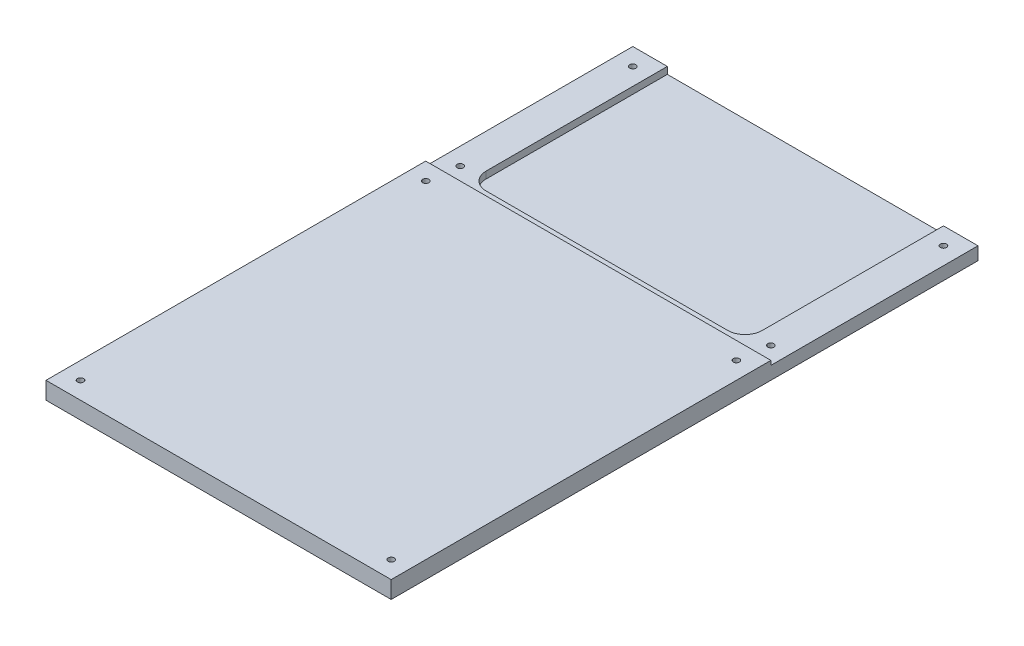
ISO-10303-21;
HEADER;
FILE_DESCRIPTION(('STEP AP214'),'2;1');
FILE_NAME('part.step','',(''),(''),'','','');
FILE_SCHEMA(('AUTOMOTIVE_DESIGN { 1 0 10303 214 1 1 1 1 }'));
ENDSEC;
DATA;
#1=APPLICATION_CONTEXT('core data for automotive mechanical design processes');
#2=APPLICATION_PROTOCOL_DEFINITION('international standard','automotive_design',2000,#1);
#3=PRODUCT_CONTEXT('',#1,'mechanical');
#4=PRODUCT('Part','Part','',(#3));
#5=PRODUCT_RELATED_PRODUCT_CATEGORY('part','',(#4));
#6=PRODUCT_DEFINITION_FORMATION('','',#4);
#7=PRODUCT_DEFINITION_CONTEXT('part definition',#1,'design');
#8=PRODUCT_DEFINITION('design','',#6,#7);
#9=PRODUCT_DEFINITION_SHAPE('','',#8);
#10=(LENGTH_UNIT() NAMED_UNIT(*) SI_UNIT(.MILLI.,.METRE.));
#11=(NAMED_UNIT(*) PLANE_ANGLE_UNIT() SI_UNIT($,.RADIAN.));
#12=(NAMED_UNIT(*) SI_UNIT($,.STERADIAN.) SOLID_ANGLE_UNIT());
#13=UNCERTAINTY_MEASURE_WITH_UNIT(LENGTH_MEASURE(1.E-05),#10,'distance_accuracy_value','');
#14=(GEOMETRIC_REPRESENTATION_CONTEXT(3) GLOBAL_UNCERTAINTY_ASSIGNED_CONTEXT((#13)) GLOBAL_UNIT_ASSIGNED_CONTEXT((#10,
#11,#12)) REPRESENTATION_CONTEXT('',''));
#15=CARTESIAN_POINT('',(0.,0.,0.));
#16=DIRECTION('',(0.,0.,1.));
#17=DIRECTION('',(1.,0.,0.));
#18=AXIS2_PLACEMENT_3D('',#15,#16,#17);
#19=CARTESIAN_POINT('',(0.,0.,0.));
#20=DIRECTION('',(0.,-1.,0.));
#21=DIRECTION('',(0.,0.,-1.));
#22=AXIS2_PLACEMENT_3D('',#19,#20,#21);
#23=PLANE('',#22);
#24=CARTESIAN_POINT('',(6.35,0.,-6.35));
#25=DIRECTION('',(0.,1.,0.));
#26=DIRECTION('',(0.,0.,1.));
#27=AXIS2_PLACEMENT_3D('',#24,#25,#26);
#28=CIRCLE('',#27,1.1303);
#29=CARTESIAN_POINT('',(6.35,0.,-5.2197));
#30=VERTEX_POINT('',#29);
#31=EDGE_CURVE('E157',#30,#30,#28,.T.);
#32=ORIENTED_EDGE('',*,*,#31,.T.);
#33=EDGE_LOOP('',(#32));
#34=FACE_BOUND('',#33,.T.);
#35=CARTESIAN_POINT('',(120.65,0.,-6.35));
#36=DIRECTION('',(0.,1.,0.));
#37=DIRECTION('',(0.,0.,1.));
#38=AXIS2_PLACEMENT_3D('',#35,#36,#37);
#39=CIRCLE('',#38,1.1303);
#40=CARTESIAN_POINT('',(120.65,0.,-5.2197));
#41=VERTEX_POINT('',#40);
#42=EDGE_CURVE('E163',#41,#41,#39,.T.);
#43=ORIENTED_EDGE('',*,*,#42,.T.);
#44=EDGE_LOOP('',(#43));
#45=FACE_BOUND('',#44,.T.);
#46=CARTESIAN_POINT('',(6.35,0.,-133.35));
#47=DIRECTION('',(0.,1.,0.));
#48=DIRECTION('',(0.,0.,1.));
#49=AXIS2_PLACEMENT_3D('',#46,#47,#48);
#50=CIRCLE('',#49,1.1303);
#51=CARTESIAN_POINT('',(6.35,0.,-132.2197));
#52=VERTEX_POINT('',#51);
#53=EDGE_CURVE('E169',#52,#52,#50,.T.);
#54=ORIENTED_EDGE('',*,*,#53,.T.);
#55=EDGE_LOOP('',(#54));
#56=FACE_BOUND('',#55,.T.);
#57=CARTESIAN_POINT('',(120.65,0.,-133.35));
#58=DIRECTION('',(0.,1.,0.));
#59=DIRECTION('',(0.,0.,1.));
#60=AXIS2_PLACEMENT_3D('',#57,#58,#59);
#61=CIRCLE('',#60,1.1303);
#62=CARTESIAN_POINT('',(120.65,0.,-132.2197));
#63=VERTEX_POINT('',#62);
#64=EDGE_CURVE('E175',#63,#63,#61,.T.);
#65=ORIENTED_EDGE('',*,*,#64,.T.);
#66=EDGE_LOOP('',(#65));
#67=FACE_BOUND('',#66,.T.);
#68=CARTESIAN_POINT('',(6.34999999999999,0.,-209.55));
#69=DIRECTION('',(0.,1.,0.));
#70=DIRECTION('',(0.,0.,1.));
#71=AXIS2_PLACEMENT_3D('',#68,#69,#70);
#72=CIRCLE('',#71,1.1303);
#73=CARTESIAN_POINT('',(6.34999999999999,0.,-208.4197));
#74=VERTEX_POINT('',#73);
#75=EDGE_CURVE('E181',#74,#74,#72,.T.);
#76=ORIENTED_EDGE('',*,*,#75,.T.);
#77=EDGE_LOOP('',(#76));
#78=FACE_BOUND('',#77,.T.);
#79=DIRECTION('',(0.,0.,1.));
#80=VECTOR('',#79,1.);
#81=CARTESIAN_POINT('',(0.,0.,0.));
#82=LINE('',#81,#80);
#83=CARTESIAN_POINT('',(0.,0.,-215.9));
#84=VERTEX_POINT('',#83);
#85=CARTESIAN_POINT('',(0.,0.,0.));
#86=VERTEX_POINT('',#85);
#87=EDGE_CURVE('E219',#84,#86,#82,.T.);
#88=ORIENTED_EDGE('',*,*,#87,.F.);
#89=DIRECTION('',(-1.,0.,0.));
#90=VECTOR('',#89,1.);
#91=CARTESIAN_POINT('',(0.,0.,-215.9));
#92=LINE('',#91,#90);
#93=CARTESIAN_POINT('',(127.,0.,-215.9));
#94=VERTEX_POINT('',#93);
#95=EDGE_CURVE('E224',#94,#84,#92,.T.);
#96=ORIENTED_EDGE('',*,*,#95,.F.);
#97=DIRECTION('',(0.,0.,-1.));
#98=VECTOR('',#97,1.);
#99=CARTESIAN_POINT('',(127.,0.,0.));
#100=LINE('',#99,#98);
#101=CARTESIAN_POINT('',(127.,0.,0.));
#102=VERTEX_POINT('',#101);
#103=EDGE_CURVE('E234',#102,#94,#100,.T.);
#104=ORIENTED_EDGE('',*,*,#103,.F.);
#105=DIRECTION('',(1.,0.,0.));
#106=VECTOR('',#105,1.);
#107=CARTESIAN_POINT('',(0.,0.,0.));
#108=LINE('',#107,#106);
#109=EDGE_CURVE('E232',#86,#102,#108,.T.);
#110=ORIENTED_EDGE('',*,*,#109,.F.);
#111=EDGE_LOOP('',(#88,#96,#104,#110));
#112=FACE_BOUND('',#111,.T.);
#113=CARTESIAN_POINT('',(120.65,0.,-209.55));
#114=DIRECTION('',(0.,1.,0.));
#115=DIRECTION('',(0.,0.,1.));
#116=AXIS2_PLACEMENT_3D('',#113,#114,#115);
#117=CIRCLE('',#116,1.1303);
#118=CARTESIAN_POINT('',(120.65,0.,-208.4197));
#119=VERTEX_POINT('',#118);
#120=EDGE_CURVE('E199',#119,#119,#117,.T.);
#121=ORIENTED_EDGE('',*,*,#120,.T.);
#122=EDGE_LOOP('',(#121));
#123=FACE_BOUND('',#122,.T.);
#124=CARTESIAN_POINT('',(120.65,0.,-146.05));
#125=DIRECTION('',(0.,1.,0.));
#126=DIRECTION('',(0.,0.,1.));
#127=AXIS2_PLACEMENT_3D('',#124,#125,#126);
#128=CIRCLE('',#127,1.1303);
#129=CARTESIAN_POINT('',(120.65,0.,-144.9197));
#130=VERTEX_POINT('',#129);
#131=EDGE_CURVE('E193',#130,#130,#128,.T.);
#132=ORIENTED_EDGE('',*,*,#131,.T.);
#133=EDGE_LOOP('',(#132));
#134=FACE_BOUND('',#133,.T.);
#135=CARTESIAN_POINT('',(6.34999999999999,0.,-146.05));
#136=DIRECTION('',(0.,1.,0.));
#137=DIRECTION('',(0.,0.,1.));
#138=AXIS2_PLACEMENT_3D('',#135,#136,#137);
#139=CIRCLE('',#138,1.1303);
#140=CARTESIAN_POINT('',(6.34999999999999,0.,-144.9197));
#141=VERTEX_POINT('',#140);
#142=EDGE_CURVE('E187',#141,#141,#139,.T.);
#143=ORIENTED_EDGE('',*,*,#142,.T.);
#144=EDGE_LOOP('',(#143));
#145=FACE_BOUND('',#144,.T.);
#146=ADVANCED_FACE('F33',(#34,#45,#56,#67,#78,#112,#123,#134,#145),#23,.T.);
#147=CARTESIAN_POINT('',(0.,6.35,-215.9));
#148=DIRECTION('',(0.,0.,1.));
#149=DIRECTION('',(1.,0.,0.));
#150=AXIS2_PLACEMENT_3D('',#147,#148,#149);
#151=PLANE('',#150);
#152=DIRECTION('',(-1.,0.,0.));
#153=VECTOR('',#152,1.);
#154=CARTESIAN_POINT('',(0.,4.7625,-215.9));
#155=LINE('',#154,#153);
#156=CARTESIAN_POINT('',(12.7,4.7625,-215.9));
#157=VERTEX_POINT('',#156);
#158=CARTESIAN_POINT('',(0.,4.7625,-215.9));
#159=VERTEX_POINT('',#158);
#160=EDGE_CURVE('E211',#157,#159,#155,.T.);
#161=ORIENTED_EDGE('',*,*,#160,.F.);
#162=DIRECTION('',(0.,1.,0.));
#163=VECTOR('',#162,1.);
#164=CARTESIAN_POINT('',(12.7,2.2225,-215.9));
#165=LINE('',#164,#163);
#166=CARTESIAN_POINT('',(12.7,2.2225,-215.9));
#167=VERTEX_POINT('',#166);
#168=EDGE_CURVE('E138',#167,#157,#165,.T.);
#169=ORIENTED_EDGE('',*,*,#168,.F.);
#170=DIRECTION('',(-1.,0.,0.));
#171=VECTOR('',#170,1.);
#172=CARTESIAN_POINT('',(12.7,2.2225,-215.9));
#173=LINE('',#172,#171);
#174=CARTESIAN_POINT('',(114.3,2.2225,-215.9));
#175=VERTEX_POINT('',#174);
#176=EDGE_CURVE('E125',#175,#167,#173,.T.);
#177=ORIENTED_EDGE('',*,*,#176,.F.);
#178=DIRECTION('',(0.,1.,0.));
#179=VECTOR('',#178,1.);
#180=CARTESIAN_POINT('',(114.3,2.2225,-215.9));
#181=LINE('',#180,#179);
#182=CARTESIAN_POINT('',(114.3,4.7625,-215.9));
#183=VERTEX_POINT('',#182);
#184=EDGE_CURVE('E131',#175,#183,#181,.T.);
#185=ORIENTED_EDGE('',*,*,#184,.T.);
#186=CARTESIAN_POINT('',(127.,4.7625,-215.9));
#187=VERTEX_POINT('',#186);
#188=EDGE_CURVE('E212',#187,#183,#155,.T.);
#189=ORIENTED_EDGE('',*,*,#188,.F.);
#190=DIRECTION('',(0.,-1.,0.));
#191=VECTOR('',#190,1.);
#192=CARTESIAN_POINT('',(127.,6.35,-215.9));
#193=LINE('',#192,#191);
#194=EDGE_CURVE('E240',#187,#94,#193,.T.);
#195=ORIENTED_EDGE('',*,*,#194,.T.);
#196=ORIENTED_EDGE('',*,*,#95,.T.);
#197=DIRECTION('',(0.,-1.,0.));
#198=VECTOR('',#197,1.);
#199=CARTESIAN_POINT('',(0.,6.35,-215.9));
#200=LINE('',#199,#198);
#201=EDGE_CURVE('E229',#159,#84,#200,.T.);
#202=ORIENTED_EDGE('',*,*,#201,.F.);
#203=EDGE_LOOP('',(#161,#169,#177,#185,#189,#195,#196,#202));
#204=FACE_BOUND('',#203,.T.);
#205=ADVANCED_FACE('F141',(#204),#151,.F.);
#206=CARTESIAN_POINT('',(0.,6.35,0.));
#207=DIRECTION('',(1.,0.,0.));
#208=DIRECTION('',(0.,0.,-1.));
#209=AXIS2_PLACEMENT_3D('',#206,#207,#208);
#210=PLANE('',#209);
#211=DIRECTION('',(0.,0.,1.));
#212=VECTOR('',#211,1.);
#213=CARTESIAN_POINT('',(0.,6.35,0.));
#214=LINE('',#213,#212);
#215=CARTESIAN_POINT('',(0.,6.35,-139.7));
#216=VERTEX_POINT('',#215);
#217=CARTESIAN_POINT('',(0.,6.35,0.));
#218=VERTEX_POINT('',#217);
#219=EDGE_CURVE('E221',#216,#218,#214,.T.);
#220=ORIENTED_EDGE('',*,*,#219,.F.);
#221=DIRECTION('',(0.,1.,0.));
#222=VECTOR('',#221,1.);
#223=CARTESIAN_POINT('',(0.,4.7625,-139.7));
#224=LINE('',#223,#222);
#225=CARTESIAN_POINT('',(0.,4.7625,-139.7));
#226=VERTEX_POINT('',#225);
#227=EDGE_CURVE('E214',#226,#216,#224,.T.);
#228=ORIENTED_EDGE('',*,*,#227,.F.);
#229=DIRECTION('',(0.,0.,1.));
#230=VECTOR('',#229,1.);
#231=CARTESIAN_POINT('',(0.,4.7625,-215.9));
#232=LINE('',#231,#230);
#233=EDGE_CURVE('E203',#159,#226,#232,.T.);
#234=ORIENTED_EDGE('',*,*,#233,.F.);
#235=ORIENTED_EDGE('',*,*,#201,.T.);
#236=ORIENTED_EDGE('',*,*,#87,.T.);
#237=DIRECTION('',(0.,-1.,0.));
#238=VECTOR('',#237,1.);
#239=CARTESIAN_POINT('',(0.,6.35,0.));
#240=LINE('',#239,#238);
#241=EDGE_CURVE('E245',#218,#86,#240,.T.);
#242=ORIENTED_EDGE('',*,*,#241,.F.);
#243=EDGE_LOOP('',(#220,#228,#234,#235,#236,#242));
#244=FACE_BOUND('',#243,.T.);
#245=ADVANCED_FACE('F290',(#244),#210,.F.);
#246=CARTESIAN_POINT('',(0.,6.35,0.));
#247=DIRECTION('',(0.,0.,-1.));
#248=DIRECTION('',(-1.,0.,0.));
#249=AXIS2_PLACEMENT_3D('',#246,#247,#248);
#250=PLANE('',#249);
#251=ORIENTED_EDGE('',*,*,#109,.T.);
#252=DIRECTION('',(0.,-1.,0.));
#253=VECTOR('',#252,1.);
#254=CARTESIAN_POINT('',(127.,6.35,0.));
#255=LINE('',#254,#253);
#256=CARTESIAN_POINT('',(127.,6.35,0.));
#257=VERTEX_POINT('',#256);
#258=EDGE_CURVE('E242',#257,#102,#255,.T.);
#259=ORIENTED_EDGE('',*,*,#258,.F.);
#260=DIRECTION('',(1.,0.,0.));
#261=VECTOR('',#260,1.);
#262=CARTESIAN_POINT('',(0.,6.35,0.));
#263=LINE('',#262,#261);
#264=EDGE_CURVE('E223',#218,#257,#263,.T.);
#265=ORIENTED_EDGE('',*,*,#264,.F.);
#266=ORIENTED_EDGE('',*,*,#241,.T.);
#267=EDGE_LOOP('',(#251,#259,#265,#266));
#268=FACE_BOUND('',#267,.T.);
#269=ADVANCED_FACE('F300',(#268),#250,.F.);
#270=CARTESIAN_POINT('',(127.,6.35,0.));
#271=DIRECTION('',(-1.,0.,0.));
#272=DIRECTION('',(0.,0.,1.));
#273=AXIS2_PLACEMENT_3D('',#270,#271,#272);
#274=PLANE('',#273);
#275=DIRECTION('',(0.,0.,-1.));
#276=VECTOR('',#275,1.);
#277=CARTESIAN_POINT('',(127.,4.7625,-215.9));
#278=LINE('',#277,#276);
#279=CARTESIAN_POINT('',(127.,4.7625,-139.7));
#280=VERTEX_POINT('',#279);
#281=EDGE_CURVE('E209',#280,#187,#278,.T.);
#282=ORIENTED_EDGE('',*,*,#281,.F.);
#283=DIRECTION('',(0.,1.,0.));
#284=VECTOR('',#283,1.);
#285=CARTESIAN_POINT('',(127.,4.7625,-139.7));
#286=LINE('',#285,#284);
#287=CARTESIAN_POINT('',(127.,6.35,-139.7));
#288=VERTEX_POINT('',#287);
#289=EDGE_CURVE('E216',#280,#288,#286,.T.);
#290=ORIENTED_EDGE('',*,*,#289,.T.);
#291=DIRECTION('',(0.,0.,-1.));
#292=VECTOR('',#291,1.);
#293=CARTESIAN_POINT('',(127.,6.35,0.));
#294=LINE('',#293,#292);
#295=EDGE_CURVE('E226',#257,#288,#294,.T.);
#296=ORIENTED_EDGE('',*,*,#295,.F.);
#297=ORIENTED_EDGE('',*,*,#258,.T.);
#298=ORIENTED_EDGE('',*,*,#103,.T.);
#299=ORIENTED_EDGE('',*,*,#194,.F.);
#300=EDGE_LOOP('',(#282,#290,#296,#297,#298,#299));
#301=FACE_BOUND('',#300,.T.);
#302=ADVANCED_FACE('F278',(#301),#274,.F.);
#303=CARTESIAN_POINT('',(0.,6.35,0.));
#304=DIRECTION('',(0.,-1.,0.));
#305=DIRECTION('',(0.,0.,-1.));
#306=AXIS2_PLACEMENT_3D('',#303,#304,#305);
#307=PLANE('',#306);
#308=CARTESIAN_POINT('',(6.35,6.35,-6.35));
#309=DIRECTION('',(0.,1.,0.));
#310=DIRECTION('',(0.,0.,1.));
#311=AXIS2_PLACEMENT_3D('',#308,#309,#310);
#312=CIRCLE('',#311,1.13029999999999);
#313=CARTESIAN_POINT('',(6.35,6.35,-5.21970000000001));
#314=VERTEX_POINT('',#313);
#315=EDGE_CURVE('E153',#314,#314,#312,.T.);
#316=ORIENTED_EDGE('',*,*,#315,.F.);
#317=EDGE_LOOP('',(#316));
#318=FACE_BOUND('',#317,.T.);
#319=CARTESIAN_POINT('',(120.65,6.35,-6.35));
#320=DIRECTION('',(0.,1.,0.));
#321=DIRECTION('',(0.,0.,1.));
#322=AXIS2_PLACEMENT_3D('',#319,#320,#321);
#323=CIRCLE('',#322,1.13029999999999);
#324=CARTESIAN_POINT('',(120.65,6.35,-5.21970000000001));
#325=VERTEX_POINT('',#324);
#326=EDGE_CURVE('E160',#325,#325,#323,.T.);
#327=ORIENTED_EDGE('',*,*,#326,.F.);
#328=EDGE_LOOP('',(#327));
#329=FACE_BOUND('',#328,.T.);
#330=CARTESIAN_POINT('',(6.35,6.35,-133.35));
#331=DIRECTION('',(0.,1.,0.));
#332=DIRECTION('',(0.,0.,1.));
#333=AXIS2_PLACEMENT_3D('',#330,#331,#332);
#334=CIRCLE('',#333,1.13029999999999);
#335=CARTESIAN_POINT('',(6.35,6.35,-132.2197));
#336=VERTEX_POINT('',#335);
#337=EDGE_CURVE('E166',#336,#336,#334,.T.);
#338=ORIENTED_EDGE('',*,*,#337,.F.);
#339=EDGE_LOOP('',(#338));
#340=FACE_BOUND('',#339,.T.);
#341=CARTESIAN_POINT('',(120.65,6.35,-133.35));
#342=DIRECTION('',(0.,1.,0.));
#343=DIRECTION('',(0.,0.,1.));
#344=AXIS2_PLACEMENT_3D('',#341,#342,#343);
#345=CIRCLE('',#344,1.13029999999999);
#346=CARTESIAN_POINT('',(120.65,6.35,-132.2197));
#347=VERTEX_POINT('',#346);
#348=EDGE_CURVE('E172',#347,#347,#345,.T.);
#349=ORIENTED_EDGE('',*,*,#348,.F.);
#350=EDGE_LOOP('',(#349));
#351=FACE_BOUND('',#350,.T.);
#352=ORIENTED_EDGE('',*,*,#295,.T.);
#353=DIRECTION('',(1.,0.,0.));
#354=VECTOR('',#353,1.);
#355=CARTESIAN_POINT('',(0.,6.35,-139.7));
#356=LINE('',#355,#354);
#357=EDGE_CURVE('E202',#216,#288,#356,.T.);
#358=ORIENTED_EDGE('',*,*,#357,.F.);
#359=ORIENTED_EDGE('',*,*,#219,.T.);
#360=ORIENTED_EDGE('',*,*,#264,.T.);
#361=EDGE_LOOP('',(#352,#358,#359,#360));
#362=FACE_BOUND('',#361,.T.);
#363=ADVANCED_FACE('F297',(#318,#329,#340,#351,#362),#307,.F.);
#364=CARTESIAN_POINT('',(0.,4.7625,-139.7));
#365=DIRECTION('',(0.,0.,1.));
#366=DIRECTION('',(1.,0.,0.));
#367=AXIS2_PLACEMENT_3D('',#364,#365,#366);
#368=PLANE('',#367);
#369=ORIENTED_EDGE('',*,*,#357,.T.);
#370=ORIENTED_EDGE('',*,*,#289,.F.);
#371=DIRECTION('',(1.,0.,0.));
#372=VECTOR('',#371,1.);
#373=CARTESIAN_POINT('',(0.,4.7625,-139.7));
#374=LINE('',#373,#372);
#375=EDGE_CURVE('E206',#226,#280,#374,.T.);
#376=ORIENTED_EDGE('',*,*,#375,.F.);
#377=ORIENTED_EDGE('',*,*,#227,.T.);
#378=EDGE_LOOP('',(#369,#370,#376,#377));
#379=FACE_BOUND('',#378,.T.);
#380=ADVANCED_FACE('F294',(#379),#368,.F.);
#381=CARTESIAN_POINT('',(0.,4.7625,0.));
#382=DIRECTION('',(0.,1.,0.));
#383=DIRECTION('',(0.,0.,1.));
#384=AXIS2_PLACEMENT_3D('',#381,#382,#383);
#385=PLANE('',#384);
#386=DIRECTION('',(0.,0.,1.));
#387=VECTOR('',#386,1.);
#388=CARTESIAN_POINT('',(12.7,4.7625,-215.9));
#389=LINE('',#388,#387);
#390=CARTESIAN_POINT('',(12.7,4.7625,-149.225));
#391=VERTEX_POINT('',#390);
#392=EDGE_CURVE('E145',#157,#391,#389,.T.);
#393=ORIENTED_EDGE('',*,*,#392,.F.);
#394=ORIENTED_EDGE('',*,*,#160,.T.);
#395=ORIENTED_EDGE('',*,*,#233,.T.);
#396=ORIENTED_EDGE('',*,*,#375,.T.);
#397=ORIENTED_EDGE('',*,*,#281,.T.);
#398=ORIENTED_EDGE('',*,*,#188,.T.);
#399=DIRECTION('',(0.,0.,-1.));
#400=VECTOR('',#399,1.);
#401=CARTESIAN_POINT('',(114.3,4.7625,-215.9));
#402=LINE('',#401,#400);
#403=CARTESIAN_POINT('',(114.3,4.7625,-149.225));
#404=VERTEX_POINT('',#403);
#405=EDGE_CURVE('E134',#404,#183,#402,.T.);
#406=ORIENTED_EDGE('',*,*,#405,.F.);
#407=CARTESIAN_POINT('',(107.95,4.7625,-149.225));
#408=DIRECTION('',(0.,1.,0.));
#409=DIRECTION('',(0.,0.,1.));
#410=AXIS2_PLACEMENT_3D('',#407,#408,#409);
#411=CIRCLE('',#410,6.35);
#412=CARTESIAN_POINT('',(107.95,4.7625,-142.875));
#413=VERTEX_POINT('',#412);
#414=EDGE_CURVE('E11',#404,#413,#411,.F.);
#415=ORIENTED_EDGE('',*,*,#414,.T.);
#416=DIRECTION('',(1.,0.,0.));
#417=VECTOR('',#416,1.);
#418=CARTESIAN_POINT('',(12.7,4.7625,-142.875));
#419=LINE('',#418,#417);
#420=CARTESIAN_POINT('',(19.05,4.7625,-142.875));
#421=VERTEX_POINT('',#420);
#422=EDGE_CURVE('E148',#421,#413,#419,.T.);
#423=ORIENTED_EDGE('',*,*,#422,.F.);
#424=CARTESIAN_POINT('',(19.05,4.7625,-149.225));
#425=DIRECTION('',(0.,1.,0.));
#426=DIRECTION('',(0.,0.,1.));
#427=AXIS2_PLACEMENT_3D('',#424,#425,#426);
#428=CIRCLE('',#427,6.35);
#429=EDGE_CURVE('E41',#421,#391,#428,.F.);
#430=ORIENTED_EDGE('',*,*,#429,.T.);
#431=EDGE_LOOP('',(#393,#394,#395,#396,#397,#398,#406,#415,#423,#430));
#432=FACE_BOUND('',#431,.T.);
#433=CARTESIAN_POINT('',(6.34999999999999,4.7625,-209.55));
#434=DIRECTION('',(0.,1.,0.));
#435=DIRECTION('',(0.,0.,1.));
#436=AXIS2_PLACEMENT_3D('',#433,#434,#435);
#437=CIRCLE('',#436,1.13029999999999);
#438=CARTESIAN_POINT('',(6.34999999999999,4.7625,-208.4197));
#439=VERTEX_POINT('',#438);
#440=EDGE_CURVE('E178',#439,#439,#437,.T.);
#441=ORIENTED_EDGE('',*,*,#440,.F.);
#442=EDGE_LOOP('',(#441));
#443=FACE_BOUND('',#442,.T.);
#444=CARTESIAN_POINT('',(6.34999999999999,4.7625,-146.05));
#445=DIRECTION('',(0.,1.,0.));
#446=DIRECTION('',(0.,0.,1.));
#447=AXIS2_PLACEMENT_3D('',#444,#445,#446);
#448=CIRCLE('',#447,1.13029999999999);
#449=CARTESIAN_POINT('',(6.34999999999999,4.7625,-144.9197));
#450=VERTEX_POINT('',#449);
#451=EDGE_CURVE('E184',#450,#450,#448,.T.);
#452=ORIENTED_EDGE('',*,*,#451,.F.);
#453=EDGE_LOOP('',(#452));
#454=FACE_BOUND('',#453,.T.);
#455=CARTESIAN_POINT('',(120.65,4.7625,-146.05));
#456=DIRECTION('',(0.,1.,0.));
#457=DIRECTION('',(0.,0.,1.));
#458=AXIS2_PLACEMENT_3D('',#455,#456,#457);
#459=CIRCLE('',#458,1.13029999999999);
#460=CARTESIAN_POINT('',(120.65,4.7625,-144.9197));
#461=VERTEX_POINT('',#460);
#462=EDGE_CURVE('E190',#461,#461,#459,.T.);
#463=ORIENTED_EDGE('',*,*,#462,.F.);
#464=EDGE_LOOP('',(#463));
#465=FACE_BOUND('',#464,.T.);
#466=CARTESIAN_POINT('',(120.65,4.7625,-209.55));
#467=DIRECTION('',(0.,1.,0.));
#468=DIRECTION('',(0.,0.,1.));
#469=AXIS2_PLACEMENT_3D('',#466,#467,#468);
#470=CIRCLE('',#469,1.13029999999999);
#471=CARTESIAN_POINT('',(120.65,4.7625,-208.4197));
#472=VERTEX_POINT('',#471);
#473=EDGE_CURVE('E196',#472,#472,#470,.T.);
#474=ORIENTED_EDGE('',*,*,#473,.F.);
#475=EDGE_LOOP('',(#474));
#476=FACE_BOUND('',#475,.T.);
#477=ADVANCED_FACE('F262',(#432,#443,#454,#465,#476),#385,.T.);
#478=CARTESIAN_POINT('',(120.65,4.7625,-209.55));
#479=DIRECTION('',(0.,1.,0.));
#480=DIRECTION('',(0.,0.,1.));
#481=AXIS2_PLACEMENT_3D('',#478,#479,#480);
#482=CYLINDRICAL_SURFACE('',#481,1.13029999999999);
#483=ORIENTED_EDGE('',*,*,#120,.F.);
#484=EDGE_LOOP('',(#483));
#485=FACE_BOUND('',#484,.T.);
#486=ORIENTED_EDGE('',*,*,#473,.T.);
#487=EDGE_LOOP('',(#486));
#488=FACE_BOUND('',#487,.T.);
#489=ADVANCED_FACE('F325',(#485,#488),#482,.F.);
#490=CARTESIAN_POINT('',(120.65,4.7625,-146.05));
#491=DIRECTION('',(0.,1.,0.));
#492=DIRECTION('',(0.,0.,1.));
#493=AXIS2_PLACEMENT_3D('',#490,#491,#492);
#494=CYLINDRICAL_SURFACE('',#493,1.13029999999999);
#495=ORIENTED_EDGE('',*,*,#131,.F.);
#496=EDGE_LOOP('',(#495));
#497=FACE_BOUND('',#496,.T.);
#498=ORIENTED_EDGE('',*,*,#462,.T.);
#499=EDGE_LOOP('',(#498));
#500=FACE_BOUND('',#499,.T.);
#501=ADVANCED_FACE('F328',(#497,#500),#494,.F.);
#502=CARTESIAN_POINT('',(6.34999999999999,4.7625,-146.05));
#503=DIRECTION('',(0.,1.,0.));
#504=DIRECTION('',(0.,0.,1.));
#505=AXIS2_PLACEMENT_3D('',#502,#503,#504);
#506=CYLINDRICAL_SURFACE('',#505,1.13029999999999);
#507=ORIENTED_EDGE('',*,*,#142,.F.);
#508=EDGE_LOOP('',(#507));
#509=FACE_BOUND('',#508,.T.);
#510=ORIENTED_EDGE('',*,*,#451,.T.);
#511=EDGE_LOOP('',(#510));
#512=FACE_BOUND('',#511,.T.);
#513=ADVANCED_FACE('F332',(#509,#512),#506,.F.);
#514=CARTESIAN_POINT('',(6.34999999999999,4.7625,-209.55));
#515=DIRECTION('',(0.,1.,0.));
#516=DIRECTION('',(0.,0.,1.));
#517=AXIS2_PLACEMENT_3D('',#514,#515,#516);
#518=CYLINDRICAL_SURFACE('',#517,1.13029999999999);
#519=ORIENTED_EDGE('',*,*,#75,.F.);
#520=EDGE_LOOP('',(#519));
#521=FACE_BOUND('',#520,.T.);
#522=ORIENTED_EDGE('',*,*,#440,.T.);
#523=EDGE_LOOP('',(#522));
#524=FACE_BOUND('',#523,.T.);
#525=ADVANCED_FACE('F336',(#521,#524),#518,.F.);
#526=CARTESIAN_POINT('',(120.65,6.35,-133.35));
#527=DIRECTION('',(0.,1.,0.));
#528=DIRECTION('',(0.,0.,1.));
#529=AXIS2_PLACEMENT_3D('',#526,#527,#528);
#530=CYLINDRICAL_SURFACE('',#529,1.13029999999999);
#531=ORIENTED_EDGE('',*,*,#64,.F.);
#532=EDGE_LOOP('',(#531));
#533=FACE_BOUND('',#532,.T.);
#534=ORIENTED_EDGE('',*,*,#348,.T.);
#535=EDGE_LOOP('',(#534));
#536=FACE_BOUND('',#535,.T.);
#537=ADVANCED_FACE('F340',(#533,#536),#530,.F.);
#538=CARTESIAN_POINT('',(6.35,6.35,-133.35));
#539=DIRECTION('',(0.,1.,0.));
#540=DIRECTION('',(0.,0.,1.));
#541=AXIS2_PLACEMENT_3D('',#538,#539,#540);
#542=CYLINDRICAL_SURFACE('',#541,1.13029999999999);
#543=ORIENTED_EDGE('',*,*,#53,.F.);
#544=EDGE_LOOP('',(#543));
#545=FACE_BOUND('',#544,.T.);
#546=ORIENTED_EDGE('',*,*,#337,.T.);
#547=EDGE_LOOP('',(#546));
#548=FACE_BOUND('',#547,.T.);
#549=ADVANCED_FACE('F344',(#545,#548),#542,.F.);
#550=CARTESIAN_POINT('',(120.65,6.35,-6.35));
#551=DIRECTION('',(0.,1.,0.));
#552=DIRECTION('',(0.,0.,1.));
#553=AXIS2_PLACEMENT_3D('',#550,#551,#552);
#554=CYLINDRICAL_SURFACE('',#553,1.13029999999999);
#555=ORIENTED_EDGE('',*,*,#42,.F.);
#556=EDGE_LOOP('',(#555));
#557=FACE_BOUND('',#556,.T.);
#558=ORIENTED_EDGE('',*,*,#326,.T.);
#559=EDGE_LOOP('',(#558));
#560=FACE_BOUND('',#559,.T.);
#561=ADVANCED_FACE('F348',(#557,#560),#554,.F.);
#562=CARTESIAN_POINT('',(6.35,6.35,-6.35));
#563=DIRECTION('',(0.,1.,0.));
#564=DIRECTION('',(0.,0.,1.));
#565=AXIS2_PLACEMENT_3D('',#562,#563,#564);
#566=CYLINDRICAL_SURFACE('',#565,1.13029999999999);
#567=ORIENTED_EDGE('',*,*,#31,.F.);
#568=EDGE_LOOP('',(#567));
#569=FACE_BOUND('',#568,.T.);
#570=ORIENTED_EDGE('',*,*,#315,.T.);
#571=EDGE_LOOP('',(#570));
#572=FACE_BOUND('',#571,.T.);
#573=ADVANCED_FACE('F352',(#569,#572),#566,.F.);
#574=CARTESIAN_POINT('',(12.7,2.2225,-215.9));
#575=DIRECTION('',(-1.,0.,0.));
#576=DIRECTION('',(0.,0.,1.));
#577=AXIS2_PLACEMENT_3D('',#574,#575,#576);
#578=PLANE('',#577);
#579=ORIENTED_EDGE('',*,*,#392,.T.);
#580=DIRECTION('',(0.,1.,0.));
#581=VECTOR('',#580,1.);
#582=CARTESIAN_POINT('',(12.7,2.2225,-149.225));
#583=LINE('',#582,#581);
#584=CARTESIAN_POINT('',(12.7,2.2225,-149.225));
#585=VERTEX_POINT('',#584);
#586=EDGE_CURVE('E253',#391,#585,#583,.F.);
#587=ORIENTED_EDGE('',*,*,#586,.T.);
#588=DIRECTION('',(0.,0.,1.));
#589=VECTOR('',#588,1.);
#590=CARTESIAN_POINT('',(12.7,2.2225,-215.9));
#591=LINE('',#590,#589);
#592=EDGE_CURVE('E152',#167,#585,#591,.T.);
#593=ORIENTED_EDGE('',*,*,#592,.F.);
#594=ORIENTED_EDGE('',*,*,#168,.T.);
#595=EDGE_LOOP('',(#579,#587,#593,#594));
#596=FACE_BOUND('',#595,.T.);
#597=ADVANCED_FACE('F268',(#596),#578,.F.);
#598=CARTESIAN_POINT('',(114.3,2.2225,-215.9));
#599=DIRECTION('',(1.,0.,0.));
#600=DIRECTION('',(0.,0.,-1.));
#601=AXIS2_PLACEMENT_3D('',#598,#599,#600);
#602=PLANE('',#601);
#603=DIRECTION('',(0.,0.,-1.));
#604=VECTOR('',#603,1.);
#605=CARTESIAN_POINT('',(114.3,2.2225,-215.9));
#606=LINE('',#605,#604);
#607=CARTESIAN_POINT('',(114.3,2.2225,-149.225));
#608=VERTEX_POINT('',#607);
#609=EDGE_CURVE('E120',#608,#175,#606,.T.);
#610=ORIENTED_EDGE('',*,*,#609,.F.);
#611=DIRECTION('',(0.,1.,0.));
#612=VECTOR('',#611,1.);
#613=CARTESIAN_POINT('',(114.3,4.7625,-149.225));
#614=LINE('',#613,#612);
#615=EDGE_CURVE('E258',#608,#404,#614,.T.);
#616=ORIENTED_EDGE('',*,*,#615,.T.);
#617=ORIENTED_EDGE('',*,*,#405,.T.);
#618=ORIENTED_EDGE('',*,*,#184,.F.);
#619=EDGE_LOOP('',(#610,#616,#617,#618));
#620=FACE_BOUND('',#619,.T.);
#621=ADVANCED_FACE('F132',(#620),#602,.F.);
#622=CARTESIAN_POINT('',(12.7,2.2225,-142.875));
#623=DIRECTION('',(0.,0.,1.));
#624=DIRECTION('',(1.,0.,0.));
#625=AXIS2_PLACEMENT_3D('',#622,#623,#624);
#626=PLANE('',#625);
#627=DIRECTION('',(1.,0.,0.));
#628=VECTOR('',#627,1.);
#629=CARTESIAN_POINT('',(12.7,2.2225,-142.875));
#630=LINE('',#629,#628);
#631=CARTESIAN_POINT('',(19.05,2.2225,-142.875));
#632=VERTEX_POINT('',#631);
#633=CARTESIAN_POINT('',(107.95,2.2225,-142.875));
#634=VERTEX_POINT('',#633);
#635=EDGE_CURVE('E128',#632,#634,#630,.T.);
#636=ORIENTED_EDGE('',*,*,#635,.F.);
#637=DIRECTION('',(0.,1.,0.));
#638=VECTOR('',#637,1.);
#639=CARTESIAN_POINT('',(19.05,4.7625,-142.875));
#640=LINE('',#639,#638);
#641=EDGE_CURVE('E250',#632,#421,#640,.T.);
#642=ORIENTED_EDGE('',*,*,#641,.T.);
#643=ORIENTED_EDGE('',*,*,#422,.T.);
#644=DIRECTION('',(0.,1.,0.));
#645=VECTOR('',#644,1.);
#646=CARTESIAN_POINT('',(107.95,2.2225,-142.875));
#647=LINE('',#646,#645);
#648=EDGE_CURVE('E248',#413,#634,#647,.F.);
#649=ORIENTED_EDGE('',*,*,#648,.T.);
#650=EDGE_LOOP('',(#636,#642,#643,#649));
#651=FACE_BOUND('',#650,.T.);
#652=ADVANCED_FACE('F273',(#651),#626,.F.);
#653=CARTESIAN_POINT('',(0.,2.2225,0.));
#654=DIRECTION('',(0.,1.,0.));
#655=DIRECTION('',(0.,0.,1.));
#656=AXIS2_PLACEMENT_3D('',#653,#654,#655);
#657=PLANE('',#656);
#658=ORIENTED_EDGE('',*,*,#592,.T.);
#659=CARTESIAN_POINT('',(19.05,2.2225,-149.225));
#660=DIRECTION('',(0.,1.,0.));
#661=DIRECTION('',(0.,0.,1.));
#662=AXIS2_PLACEMENT_3D('',#659,#660,#661);
#663=CIRCLE('',#662,6.35);
#664=EDGE_CURVE('E256',#585,#632,#663,.T.);
#665=ORIENTED_EDGE('',*,*,#664,.T.);
#666=ORIENTED_EDGE('',*,*,#635,.T.);
#667=CARTESIAN_POINT('',(107.95,2.2225,-149.225));
#668=DIRECTION('',(0.,1.,0.));
#669=DIRECTION('',(0.,0.,1.));
#670=AXIS2_PLACEMENT_3D('',#667,#668,#669);
#671=CIRCLE('',#670,6.35);
#672=EDGE_CURVE('E54',#634,#608,#671,.T.);
#673=ORIENTED_EDGE('',*,*,#672,.T.);
#674=ORIENTED_EDGE('',*,*,#609,.T.);
#675=ORIENTED_EDGE('',*,*,#176,.T.);
#676=EDGE_LOOP('',(#658,#665,#666,#673,#674,#675));
#677=FACE_BOUND('',#676,.T.);
#678=ADVANCED_FACE('F123',(#677),#657,.T.);
#679=CARTESIAN_POINT('',(19.05,2.2225,-149.225));
#680=DIRECTION('',(0.,-1.,0.));
#681=DIRECTION('',(0.,0.,-1.));
#682=AXIS2_PLACEMENT_3D('',#679,#680,#681);
#683=CYLINDRICAL_SURFACE('',#682,6.35);
#684=ORIENTED_EDGE('',*,*,#664,.F.);
#685=ORIENTED_EDGE('',*,*,#586,.F.);
#686=ORIENTED_EDGE('',*,*,#429,.F.);
#687=ORIENTED_EDGE('',*,*,#641,.F.);
#688=EDGE_LOOP('',(#684,#685,#686,#687));
#689=FACE_BOUND('',#688,.T.);
#690=ADVANCED_FACE('F270',(#689),#683,.F.);
#691=CARTESIAN_POINT('',(107.95,2.2225,-149.225));
#692=DIRECTION('',(0.,-1.,0.));
#693=DIRECTION('',(0.,0.,-1.));
#694=AXIS2_PLACEMENT_3D('',#691,#692,#693);
#695=CYLINDRICAL_SURFACE('',#694,6.35);
#696=ORIENTED_EDGE('',*,*,#672,.F.);
#697=ORIENTED_EDGE('',*,*,#648,.F.);
#698=ORIENTED_EDGE('',*,*,#414,.F.);
#699=ORIENTED_EDGE('',*,*,#615,.F.);
#700=EDGE_LOOP('',(#696,#697,#698,#699));
#701=FACE_BOUND('',#700,.T.);
#702=ADVANCED_FACE('F35',(#701),#695,.F.);
#703=CLOSED_SHELL('',(#146,#205,#245,#269,#302,#363,#380,#477,#489,#501,#513,#525,#537,#549,
#561,#573,#597,#621,#652,#678,#690,#702));
#704=MANIFOLD_SOLID_BREP('B2',#703);
#705=ADVANCED_BREP_SHAPE_REPRESENTATION('',(#18,#704),#14);
#706=SHAPE_DEFINITION_REPRESENTATION(#9,#705);
ENDSEC;
END-ISO-10303-21;
